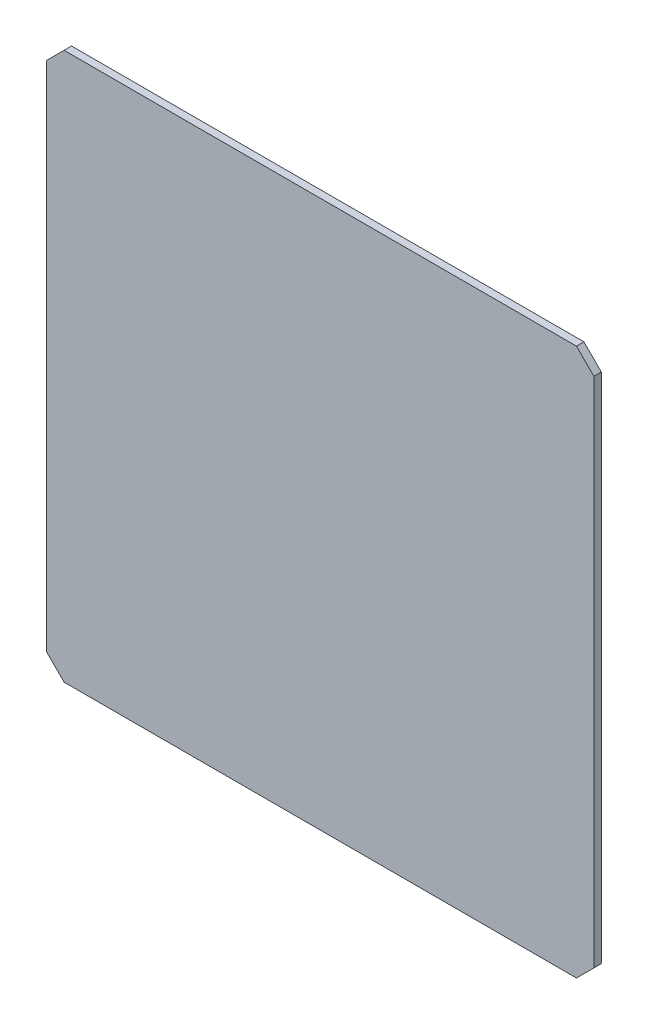
ISO-10303-21;
HEADER;
FILE_DESCRIPTION(('STEP AP214'),'2;1');
FILE_NAME('part.step','',(''),(''),'','','');
FILE_SCHEMA(('AUTOMOTIVE_DESIGN { 1 0 10303 214 1 1 1 1 }'));
ENDSEC;
DATA;
#1=APPLICATION_CONTEXT('core data for automotive mechanical design processes');
#2=APPLICATION_PROTOCOL_DEFINITION('international standard','automotive_design',2000,#1);
#3=PRODUCT_CONTEXT('',#1,'mechanical');
#4=PRODUCT('Part','Part','',(#3));
#5=PRODUCT_RELATED_PRODUCT_CATEGORY('part','',(#4));
#6=PRODUCT_DEFINITION_FORMATION('','',#4);
#7=PRODUCT_DEFINITION_CONTEXT('part definition',#1,'design');
#8=PRODUCT_DEFINITION('design','',#6,#7);
#9=PRODUCT_DEFINITION_SHAPE('','',#8);
#10=(LENGTH_UNIT() NAMED_UNIT(*) SI_UNIT(.MILLI.,.METRE.));
#11=(NAMED_UNIT(*) PLANE_ANGLE_UNIT() SI_UNIT($,.RADIAN.));
#12=(NAMED_UNIT(*) SI_UNIT($,.STERADIAN.) SOLID_ANGLE_UNIT());
#13=UNCERTAINTY_MEASURE_WITH_UNIT(LENGTH_MEASURE(1.E-05),#10,'distance_accuracy_value','');
#14=(GEOMETRIC_REPRESENTATION_CONTEXT(3) GLOBAL_UNCERTAINTY_ASSIGNED_CONTEXT((#13)) GLOBAL_UNIT_ASSIGNED_CONTEXT((#10,
#11,#12)) REPRESENTATION_CONTEXT('',''));
#15=CARTESIAN_POINT('',(0.,0.,0.));
#16=DIRECTION('',(0.,0.,1.));
#17=DIRECTION('',(1.,0.,0.));
#18=AXIS2_PLACEMENT_3D('',#15,#16,#17);
#19=CARTESIAN_POINT('',(0.,0.,-3.));
#20=DIRECTION('',(-1.,0.,0.));
#21=DIRECTION('',(0.,0.,1.));
#22=AXIS2_PLACEMENT_3D('',#19,#20,#21);
#23=PLANE('',#22);
#24=DIRECTION('',(0.,-1.,0.));
#25=VECTOR('',#24,1.);
#26=CARTESIAN_POINT('',(0.,0.,-3.));
#27=LINE('',#26,#25);
#28=CARTESIAN_POINT('',(0.,213.,-3.));
#29=VERTEX_POINT('',#28);
#30=CARTESIAN_POINT('',(0.,6.99999999999998,-3.));
#31=VERTEX_POINT('',#30);
#32=EDGE_CURVE('E192',#29,#31,#27,.T.);
#33=ORIENTED_EDGE('',*,*,#32,.T.);
#34=DIRECTION('',(0.,0.,1.));
#35=VECTOR('',#34,1.);
#36=CARTESIAN_POINT('',(0.,6.99999999999998,-3.));
#37=LINE('',#36,#35);
#38=CARTESIAN_POINT('',(0.,6.99999999999998,0.));
#39=VERTEX_POINT('',#38);
#40=EDGE_CURVE('E121',#31,#39,#37,.T.);
#41=ORIENTED_EDGE('',*,*,#40,.T.);
#42=DIRECTION('',(0.,-1.,0.));
#43=VECTOR('',#42,1.);
#44=CARTESIAN_POINT('',(0.,0.,0.));
#45=LINE('',#44,#43);
#46=CARTESIAN_POINT('',(0.,213.,0.));
#47=VERTEX_POINT('',#46);
#48=EDGE_CURVE('E112',#47,#39,#45,.T.);
#49=ORIENTED_EDGE('',*,*,#48,.F.);
#50=DIRECTION('',(0.,0.,-1.));
#51=VECTOR('',#50,1.);
#52=CARTESIAN_POINT('',(0.,213.,-3.));
#53=LINE('',#52,#51);
#54=EDGE_CURVE('E126',#47,#29,#53,.T.);
#55=ORIENTED_EDGE('',*,*,#54,.T.);
#56=EDGE_LOOP('',(#33,#41,#49,#55));
#57=FACE_BOUND('',#56,.T.);
#58=ADVANCED_FACE('F41',(#57),#23,.T.);
#59=CARTESIAN_POINT('',(0.,220.,-3.));
#60=DIRECTION('',(0.,1.,0.));
#61=DIRECTION('',(-1.,0.,0.));
#62=AXIS2_PLACEMENT_3D('',#59,#60,#61);
#63=PLANE('',#62);
#64=DIRECTION('',(-1.,0.,0.));
#65=VECTOR('',#64,1.);
#66=CARTESIAN_POINT('',(0.,220.,0.));
#67=LINE('',#66,#65);
#68=CARTESIAN_POINT('',(213.,220.,0.));
#69=VERTEX_POINT('',#68);
#70=CARTESIAN_POINT('',(6.99999999999998,220.,0.));
#71=VERTEX_POINT('',#70);
#72=EDGE_CURVE('E114',#69,#71,#67,.T.);
#73=ORIENTED_EDGE('',*,*,#72,.F.);
#74=DIRECTION('',(0.,0.,-1.));
#75=VECTOR('',#74,1.);
#76=CARTESIAN_POINT('',(213.,220.,-3.));
#77=LINE('',#76,#75);
#78=CARTESIAN_POINT('',(213.,220.,-3.));
#79=VERTEX_POINT('',#78);
#80=EDGE_CURVE('E11',#69,#79,#77,.T.);
#81=ORIENTED_EDGE('',*,*,#80,.T.);
#82=DIRECTION('',(-1.,0.,0.));
#83=VECTOR('',#82,1.);
#84=CARTESIAN_POINT('',(0.,220.,-3.));
#85=LINE('',#84,#83);
#86=CARTESIAN_POINT('',(6.99999999999998,220.,-3.));
#87=VERTEX_POINT('',#86);
#88=EDGE_CURVE('E135',#79,#87,#85,.T.);
#89=ORIENTED_EDGE('',*,*,#88,.T.);
#90=DIRECTION('',(0.,0.,1.));
#91=VECTOR('',#90,1.);
#92=CARTESIAN_POINT('',(6.99999999999998,220.,-3.));
#93=LINE('',#92,#91);
#94=EDGE_CURVE('E51',#87,#71,#93,.T.);
#95=ORIENTED_EDGE('',*,*,#94,.T.);
#96=EDGE_LOOP('',(#73,#81,#89,#95));
#97=FACE_BOUND('',#96,.T.);
#98=ADVANCED_FACE('F178',(#97),#63,.T.);
#99=CARTESIAN_POINT('',(220.,0.,-3.));
#100=DIRECTION('',(1.,0.,0.));
#101=DIRECTION('',(0.,0.,-1.));
#102=AXIS2_PLACEMENT_3D('',#99,#100,#101);
#103=PLANE('',#102);
#104=DIRECTION('',(0.,1.,0.));
#105=VECTOR('',#104,1.);
#106=CARTESIAN_POINT('',(220.,0.,0.));
#107=LINE('',#106,#105);
#108=CARTESIAN_POINT('',(220.,7.00000000000003,0.));
#109=VERTEX_POINT('',#108);
#110=CARTESIAN_POINT('',(220.,213.,0.));
#111=VERTEX_POINT('',#110);
#112=EDGE_CURVE('E187',#109,#111,#107,.T.);
#113=ORIENTED_EDGE('',*,*,#112,.F.);
#114=DIRECTION('',(0.,0.,-1.));
#115=VECTOR('',#114,1.);
#116=CARTESIAN_POINT('',(220.,7.00000000000003,-3.));
#117=LINE('',#116,#115);
#118=CARTESIAN_POINT('',(220.,7.00000000000003,-3.));
#119=VERTEX_POINT('',#118);
#120=EDGE_CURVE('E65',#109,#119,#117,.T.);
#121=ORIENTED_EDGE('',*,*,#120,.T.);
#122=DIRECTION('',(0.,1.,0.));
#123=VECTOR('',#122,1.);
#124=CARTESIAN_POINT('',(220.,0.,-3.));
#125=LINE('',#124,#123);
#126=CARTESIAN_POINT('',(220.,213.,-3.));
#127=VERTEX_POINT('',#126);
#128=EDGE_CURVE('E141',#119,#127,#125,.T.);
#129=ORIENTED_EDGE('',*,*,#128,.T.);
#130=DIRECTION('',(0.,0.,1.));
#131=VECTOR('',#130,1.);
#132=CARTESIAN_POINT('',(220.,213.,-3.));
#133=LINE('',#132,#131);
#134=EDGE_CURVE('E171',#127,#111,#133,.T.);
#135=ORIENTED_EDGE('',*,*,#134,.T.);
#136=EDGE_LOOP('',(#113,#121,#129,#135));
#137=FACE_BOUND('',#136,.T.);
#138=ADVANCED_FACE('F186',(#137),#103,.T.);
#139=CARTESIAN_POINT('',(0.,0.,-3.));
#140=DIRECTION('',(0.,-1.,0.));
#141=DIRECTION('',(0.,0.,-1.));
#142=AXIS2_PLACEMENT_3D('',#139,#140,#141);
#143=PLANE('',#142);
#144=DIRECTION('',(1.,0.,0.));
#145=VECTOR('',#144,1.);
#146=CARTESIAN_POINT('',(0.,0.,0.));
#147=LINE('',#146,#145);
#148=CARTESIAN_POINT('',(7.00000000000003,0.,0.));
#149=VERTEX_POINT('',#148);
#150=CARTESIAN_POINT('',(213.,0.,0.));
#151=VERTEX_POINT('',#150);
#152=EDGE_CURVE('E130',#149,#151,#147,.T.);
#153=ORIENTED_EDGE('',*,*,#152,.F.);
#154=DIRECTION('',(0.,0.,-1.));
#155=VECTOR('',#154,1.);
#156=CARTESIAN_POINT('',(7.00000000000003,0.,-3.));
#157=LINE('',#156,#155);
#158=CARTESIAN_POINT('',(7.00000000000003,0.,-3.));
#159=VERTEX_POINT('',#158);
#160=EDGE_CURVE('E158',#149,#159,#157,.T.);
#161=ORIENTED_EDGE('',*,*,#160,.T.);
#162=DIRECTION('',(1.,0.,0.));
#163=VECTOR('',#162,1.);
#164=CARTESIAN_POINT('',(0.,0.,-3.));
#165=LINE('',#164,#163);
#166=CARTESIAN_POINT('',(213.,0.,-3.));
#167=VERTEX_POINT('',#166);
#168=EDGE_CURVE('E197',#159,#167,#165,.T.);
#169=ORIENTED_EDGE('',*,*,#168,.T.);
#170=DIRECTION('',(0.,0.,1.));
#171=VECTOR('',#170,1.);
#172=CARTESIAN_POINT('',(213.,0.,-3.));
#173=LINE('',#172,#171);
#174=EDGE_CURVE('E154',#167,#151,#173,.T.);
#175=ORIENTED_EDGE('',*,*,#174,.T.);
#176=EDGE_LOOP('',(#153,#161,#169,#175));
#177=FACE_BOUND('',#176,.T.);
#178=ADVANCED_FACE('F208',(#177),#143,.T.);
#179=CARTESIAN_POINT('',(0.,0.,-3.));
#180=DIRECTION('',(0.,0.,-1.));
#181=DIRECTION('',(-1.,0.,0.));
#182=AXIS2_PLACEMENT_3D('',#179,#180,#181);
#183=PLANE('',#182);
#184=ORIENTED_EDGE('',*,*,#168,.F.);
#185=DIRECTION('',(0.70710678118655,-0.707106781186545,0.));
#186=VECTOR('',#185,1.);
#187=CARTESIAN_POINT('',(3.49999999999999,3.50000000000002,-3.));
#188=LINE('',#187,#186);
#189=EDGE_CURVE('E168',#159,#31,#188,.F.);
#190=ORIENTED_EDGE('',*,*,#189,.T.);
#191=ORIENTED_EDGE('',*,*,#32,.F.);
#192=DIRECTION('',(-0.707106781186545,-0.70710678118655,0.));
#193=VECTOR('',#192,1.);
#194=CARTESIAN_POINT('',(-106.5,106.499999999999,-3.));
#195=LINE('',#194,#193);
#196=EDGE_CURVE('E133',#29,#87,#195,.F.);
#197=ORIENTED_EDGE('',*,*,#196,.T.);
#198=ORIENTED_EDGE('',*,*,#88,.F.);
#199=DIRECTION('',(-0.707106781186549,0.707106781186546,0.));
#200=VECTOR('',#199,1.);
#201=CARTESIAN_POINT('',(216.5,216.5,-3.));
#202=LINE('',#201,#200);
#203=EDGE_CURVE('E58',#79,#127,#202,.F.);
#204=ORIENTED_EDGE('',*,*,#203,.T.);
#205=ORIENTED_EDGE('',*,*,#128,.F.);
#206=DIRECTION('',(0.707106781186546,0.707106781186549,0.));
#207=VECTOR('',#206,1.);
#208=CARTESIAN_POINT('',(106.5,-106.5,-3.));
#209=LINE('',#208,#207);
#210=EDGE_CURVE('E165',#119,#167,#209,.F.);
#211=ORIENTED_EDGE('',*,*,#210,.T.);
#212=EDGE_LOOP('',(#184,#190,#191,#197,#198,#204,#205,#211));
#213=FACE_BOUND('',#212,.T.);
#214=ADVANCED_FACE('F181',(#213),#183,.T.);
#215=CARTESIAN_POINT('',(0.,0.,0.));
#216=DIRECTION('',(0.,0.,-1.));
#217=DIRECTION('',(-1.,0.,0.));
#218=AXIS2_PLACEMENT_3D('',#215,#216,#217);
#219=PLANE('',#218);
#220=ORIENTED_EDGE('',*,*,#48,.T.);
#221=DIRECTION('',(-0.70710678118655,0.707106781186545,0.));
#222=VECTOR('',#221,1.);
#223=CARTESIAN_POINT('',(0.,6.99999999999998,0.));
#224=LINE('',#223,#222);
#225=EDGE_CURVE('E151',#39,#149,#224,.F.);
#226=ORIENTED_EDGE('',*,*,#225,.T.);
#227=ORIENTED_EDGE('',*,*,#152,.T.);
#228=DIRECTION('',(-0.707106781186546,-0.707106781186549,0.));
#229=VECTOR('',#228,1.);
#230=CARTESIAN_POINT('',(213.,0.,0.));
#231=LINE('',#230,#229);
#232=EDGE_CURVE('E148',#151,#109,#231,.F.);
#233=ORIENTED_EDGE('',*,*,#232,.T.);
#234=ORIENTED_EDGE('',*,*,#112,.T.);
#235=DIRECTION('',(0.707106781186549,-0.707106781186546,0.));
#236=VECTOR('',#235,1.);
#237=CARTESIAN_POINT('',(220.,213.,0.));
#238=LINE('',#237,#236);
#239=EDGE_CURVE('E120',#111,#69,#238,.F.);
#240=ORIENTED_EDGE('',*,*,#239,.T.);
#241=ORIENTED_EDGE('',*,*,#72,.T.);
#242=DIRECTION('',(0.707106781186545,0.70710678118655,0.));
#243=VECTOR('',#242,1.);
#244=CARTESIAN_POINT('',(6.99999999999998,220.,0.));
#245=LINE('',#244,#243);
#246=EDGE_CURVE('E109',#71,#47,#245,.F.);
#247=ORIENTED_EDGE('',*,*,#246,.T.);
#248=EDGE_LOOP('',(#220,#226,#227,#233,#234,#240,#241,#247));
#249=FACE_BOUND('',#248,.T.);
#250=ADVANCED_FACE('F111',(#249),#219,.F.);
#251=CARTESIAN_POINT('',(0.,6.99999999999998,-3.));
#252=DIRECTION('',(0.707106781186545,0.70710678118655,0.));
#253=DIRECTION('',(0.,0.,1.));
#254=AXIS2_PLACEMENT_3D('',#251,#252,#253);
#255=PLANE('',#254);
#256=ORIENTED_EDGE('',*,*,#189,.F.);
#257=ORIENTED_EDGE('',*,*,#160,.F.);
#258=ORIENTED_EDGE('',*,*,#225,.F.);
#259=ORIENTED_EDGE('',*,*,#40,.F.);
#260=EDGE_LOOP('',(#256,#257,#258,#259));
#261=FACE_BOUND('',#260,.T.);
#262=ADVANCED_FACE('F204',(#261),#255,.F.);
#263=CARTESIAN_POINT('',(213.,0.,-3.));
#264=DIRECTION('',(-0.707106781186549,0.707106781186546,0.));
#265=DIRECTION('',(0.,0.,1.));
#266=AXIS2_PLACEMENT_3D('',#263,#264,#265);
#267=PLANE('',#266);
#268=ORIENTED_EDGE('',*,*,#210,.F.);
#269=ORIENTED_EDGE('',*,*,#120,.F.);
#270=ORIENTED_EDGE('',*,*,#232,.F.);
#271=ORIENTED_EDGE('',*,*,#174,.F.);
#272=EDGE_LOOP('',(#268,#269,#270,#271));
#273=FACE_BOUND('',#272,.T.);
#274=ADVANCED_FACE('F212',(#273),#267,.F.);
#275=CARTESIAN_POINT('',(220.,213.,-3.));
#276=DIRECTION('',(-0.707106781186546,-0.707106781186549,0.));
#277=DIRECTION('',(0.,0.,1.));
#278=AXIS2_PLACEMENT_3D('',#275,#276,#277);
#279=PLANE('',#278);
#280=ORIENTED_EDGE('',*,*,#203,.F.);
#281=ORIENTED_EDGE('',*,*,#80,.F.);
#282=ORIENTED_EDGE('',*,*,#239,.F.);
#283=ORIENTED_EDGE('',*,*,#134,.F.);
#284=EDGE_LOOP('',(#280,#281,#282,#283));
#285=FACE_BOUND('',#284,.T.);
#286=ADVANCED_FACE('F184',(#285),#279,.F.);
#287=CARTESIAN_POINT('',(6.99999999999998,220.,-3.));
#288=DIRECTION('',(0.70710678118655,-0.707106781186545,0.));
#289=DIRECTION('',(0.,0.,1.));
#290=AXIS2_PLACEMENT_3D('',#287,#288,#289);
#291=PLANE('',#290);
#292=ORIENTED_EDGE('',*,*,#196,.F.);
#293=ORIENTED_EDGE('',*,*,#54,.F.);
#294=ORIENTED_EDGE('',*,*,#246,.F.);
#295=ORIENTED_EDGE('',*,*,#94,.F.);
#296=EDGE_LOOP('',(#292,#293,#294,#295));
#297=FACE_BOUND('',#296,.T.);
#298=ADVANCED_FACE('F44',(#297),#291,.F.);
#299=CLOSED_SHELL('',(#58,#98,#138,#178,#214,#250,#262,#274,#286,#298));
#300=MANIFOLD_SOLID_BREP('B2',#299);
#301=ADVANCED_BREP_SHAPE_REPRESENTATION('',(#18,#300),#14);
#302=SHAPE_DEFINITION_REPRESENTATION(#9,#301);
ENDSEC;
END-ISO-10303-21;
